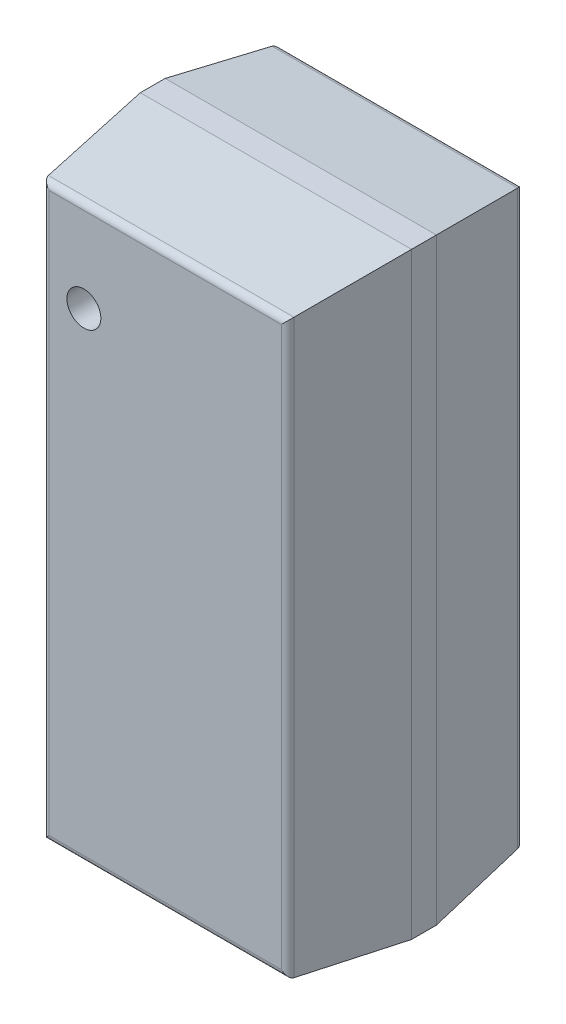
ISO-10303-21;
HEADER;
FILE_DESCRIPTION(('STEP AP214'),'2;1');
FILE_NAME('part.step','',(''),(''),'','','');
FILE_SCHEMA(('AUTOMOTIVE_DESIGN { 1 0 10303 214 1 1 1 1 }'));
ENDSEC;
DATA;
#1=APPLICATION_CONTEXT('core data for automotive mechanical design processes');
#2=APPLICATION_PROTOCOL_DEFINITION('international standard','automotive_design',2000,#1);
#3=PRODUCT_CONTEXT('',#1,'mechanical');
#4=PRODUCT('Part','Part','',(#3));
#5=PRODUCT_RELATED_PRODUCT_CATEGORY('part','',(#4));
#6=PRODUCT_DEFINITION_FORMATION('','',#4);
#7=PRODUCT_DEFINITION_CONTEXT('part definition',#1,'design');
#8=PRODUCT_DEFINITION('design','',#6,#7);
#9=PRODUCT_DEFINITION_SHAPE('','',#8);
#10=(LENGTH_UNIT() NAMED_UNIT(*) SI_UNIT(.MILLI.,.METRE.));
#11=(NAMED_UNIT(*) PLANE_ANGLE_UNIT() SI_UNIT($,.RADIAN.));
#12=(NAMED_UNIT(*) SI_UNIT($,.STERADIAN.) SOLID_ANGLE_UNIT());
#13=UNCERTAINTY_MEASURE_WITH_UNIT(LENGTH_MEASURE(1.E-05),#10,'distance_accuracy_value','');
#14=(GEOMETRIC_REPRESENTATION_CONTEXT(3) GLOBAL_UNCERTAINTY_ASSIGNED_CONTEXT((#13)) GLOBAL_UNIT_ASSIGNED_CONTEXT((#10,
#11,#12)) REPRESENTATION_CONTEXT('',''));
#15=CARTESIAN_POINT('',(0.,0.,0.));
#16=DIRECTION('',(0.,0.,1.));
#17=DIRECTION('',(1.,0.,0.));
#18=AXIS2_PLACEMENT_3D('',#15,#16,#17);
#19=CARTESIAN_POINT('',(-0.3975,0.95,1.08));
#20=DIRECTION('',(0.,0.,1.));
#21=DIRECTION('',(1.,0.,0.));
#22=AXIS2_PLACEMENT_3D('',#19,#20,#21);
#23=PLANE('',#22);
#24=CARTESIAN_POINT('',(-0.3975,0.95,1.08));
#25=DIRECTION('',(0.,0.,1.));
#26=DIRECTION('',(1.,0.,0.));
#27=AXIS2_PLACEMENT_3D('',#24,#25,#26);
#28=CIRCLE('',#27,0.0828125);
#29=CARTESIAN_POINT('',(-0.3146875,0.95,1.08));
#30=VERTEX_POINT('',#29);
#31=EDGE_CURVE('E20',#30,#30,#28,.T.);
#32=ORIENTED_EDGE('',*,*,#31,.T.);
#33=EDGE_LOOP('',(#32));
#34=FACE_BOUND('',#33,.T.);
#35=ADVANCED_FACE('F17',(#34),#23,.T.);
#36=CARTESIAN_POINT('',(-0.3975,0.95,1.08));
#37=DIRECTION('',(0.,0.,1.));
#38=DIRECTION('',(1.,0.,0.));
#39=AXIS2_PLACEMENT_3D('',#36,#37,#38);
#40=CYLINDRICAL_SURFACE('',#39,0.0828125);
#41=CARTESIAN_POINT('',(-0.3975,0.95,1.2));
#42=DIRECTION('',(0.,0.,1.));
#43=DIRECTION('',(1.,0.,0.));
#44=AXIS2_PLACEMENT_3D('',#41,#42,#43);
#45=CIRCLE('',#44,0.0828125);
#46=CARTESIAN_POINT('',(-0.3146875,0.95,1.2));
#47=VERTEX_POINT('',#46);
#48=EDGE_CURVE('E100',#47,#47,#45,.F.);
#49=ORIENTED_EDGE('',*,*,#48,.F.);
#50=EDGE_LOOP('',(#49));
#51=FACE_BOUND('',#50,.T.);
#52=ORIENTED_EDGE('',*,*,#31,.F.);
#53=EDGE_LOOP('',(#52));
#54=FACE_BOUND('',#53,.T.);
#55=ADVANCED_FACE('F496',(#51,#54),#40,.F.);
#56=CARTESIAN_POINT('',(-0.6625,-1.46,1.2));
#57=DIRECTION('',(0.,0.,1.));
#58=DIRECTION('',(1.,0.,0.));
#59=AXIS2_PLACEMENT_3D('',#56,#57,#58);
#60=PLANE('',#59);
#61=ORIENTED_EDGE('',*,*,#48,.T.);
#62=EDGE_LOOP('',(#61));
#63=FACE_BOUND('',#62,.T.);
#64=DIRECTION('',(0.,1.,0.));
#65=VECTOR('',#64,1.);
#66=CARTESIAN_POINT('',(0.56693691466,-1.39375,1.2));
#67=LINE('',#66,#65);
#68=CARTESIAN_POINT('',(0.56693691466,1.36443691466,1.2));
#69=VERTEX_POINT('',#68);
#70=CARTESIAN_POINT('',(0.56693691466,-1.36443691466,1.2));
#71=VERTEX_POINT('',#70);
#72=EDGE_CURVE('E107',#69,#71,#67,.F.);
#73=ORIENTED_EDGE('',*,*,#72,.F.);
#74=DIRECTION('',(1.,0.,0.));
#75=VECTOR('',#74,1.);
#76=CARTESIAN_POINT('',(-0.6625,1.36443691466,1.2));
#77=LINE('',#76,#75);
#78=CARTESIAN_POINT('',(-0.56693691466,1.36443691466,1.2));
#79=VERTEX_POINT('',#78);
#80=EDGE_CURVE('E96',#69,#79,#77,.F.);
#81=ORIENTED_EDGE('',*,*,#80,.T.);
#82=DIRECTION('',(0.,1.,0.));
#83=VECTOR('',#82,1.);
#84=CARTESIAN_POINT('',(-0.56693691466,-1.39375,1.2));
#85=LINE('',#84,#83);
#86=CARTESIAN_POINT('',(-0.56693691466,-1.36443691466,1.2));
#87=VERTEX_POINT('',#86);
#88=EDGE_CURVE('E92',#87,#79,#85,.T.);
#89=ORIENTED_EDGE('',*,*,#88,.F.);
#90=DIRECTION('',(1.,0.,0.));
#91=VECTOR('',#90,1.);
#92=CARTESIAN_POINT('',(-0.59625,-1.36443691466,1.2));
#93=LINE('',#92,#91);
#94=EDGE_CURVE('E81',#71,#87,#93,.F.);
#95=ORIENTED_EDGE('',*,*,#94,.F.);
#96=EDGE_LOOP('',(#73,#81,#89,#95));
#97=FACE_BOUND('',#96,.T.);
#98=ADVANCED_FACE('F95',(#63,#97),#60,.T.);
#99=CARTESIAN_POINT('',(-0.56693691466,-1.39375,1.166875));
#100=DIRECTION('',(0.,1.,0.));
#101=DIRECTION('',(0.,0.,1.));
#102=AXIS2_PLACEMENT_3D('',#99,#100,#101);
#103=CYLINDRICAL_SURFACE('',#102,0.033125);
#104=CARTESIAN_POINT('',(-0.56693691466,1.36443691466,1.166875));
#105=DIRECTION('',(0.707106781186547,0.707106781186547,0.));
#106=DIRECTION('',(0.707106781186547,-0.707106781186547,0.));
#107=AXIS2_PLACEMENT_3D('',#104,#105,#106);
#108=ELLIPSE('',#107,0.0468458242536088,0.033125);
#109=CARTESIAN_POINT('',(-0.59981590205622,1.39731590205646,1.17090461695283));
#110=VERTEX_POINT('',#109);
#111=EDGE_CURVE('E129',#110,#79,#108,.T.);
#112=ORIENTED_EDGE('',*,*,#111,.F.);
#113=DIRECTION('',(0.,1.,0.));
#114=VECTOR('',#113,1.);
#115=CARTESIAN_POINT('',(-0.59981590205648,-1.46,1.17090461695306));
#116=LINE('',#115,#114);
#117=CARTESIAN_POINT('',(-0.59981590205622,-1.39731590205646,1.17090461695283));
#118=VERTEX_POINT('',#117);
#119=EDGE_CURVE('E104',#110,#118,#116,.F.);
#120=ORIENTED_EDGE('',*,*,#119,.T.);
#121=CARTESIAN_POINT('',(-0.56693691466,-1.36443691466,1.166875));
#122=DIRECTION('',(0.707106781186547,-0.707106781186547,0.));
#123=DIRECTION('',(0.707106781186547,0.707106781186547,0.));
#124=AXIS2_PLACEMENT_3D('',#121,#122,#123);
#125=ELLIPSE('',#124,0.0468458242536088,0.033125);
#126=EDGE_CURVE('E86',#87,#118,#125,.T.);
#127=ORIENTED_EDGE('',*,*,#126,.F.);
#128=ORIENTED_EDGE('',*,*,#88,.T.);
#129=EDGE_LOOP('',(#112,#120,#127,#128));
#130=FACE_BOUND('',#129,.T.);
#131=ADVANCED_FACE('F103',(#130),#103,.T.);
#132=CARTESIAN_POINT('',(-0.59625,-1.36443691466,1.166875));
#133=DIRECTION('',(1.,0.,0.));
#134=DIRECTION('',(0.,0.,-1.));
#135=AXIS2_PLACEMENT_3D('',#132,#133,#134);
#136=CYLINDRICAL_SURFACE('',#135,0.033125);
#137=ORIENTED_EDGE('',*,*,#94,.T.);
#138=ORIENTED_EDGE('',*,*,#126,.T.);
#139=DIRECTION('',(1.,0.,0.));
#140=VECTOR('',#139,1.);
#141=CARTESIAN_POINT('',(-0.6625,-1.39731590205648,1.17090461695306));
#142=LINE('',#141,#140);
#143=CARTESIAN_POINT('',(0.59981590205646,-1.39731590205622,1.17090461695283));
#144=VERTEX_POINT('',#143);
#145=EDGE_CURVE('E141',#118,#144,#142,.T.);
#146=ORIENTED_EDGE('',*,*,#145,.T.);
#147=CARTESIAN_POINT('',(0.56693691466,-1.36443691466,1.166875));
#148=DIRECTION('',(0.707106781186547,0.707106781186547,0.));
#149=DIRECTION('',(-0.707106781186547,0.707106781186547,0.));
#150=AXIS2_PLACEMENT_3D('',#147,#148,#149);
#151=ELLIPSE('',#150,0.0468458242536088,0.033125);
#152=EDGE_CURVE('E88',#71,#144,#151,.T.);
#153=ORIENTED_EDGE('',*,*,#152,.F.);
#154=EDGE_LOOP('',(#137,#138,#146,#153));
#155=FACE_BOUND('',#154,.T.);
#156=ADVANCED_FACE('F83',(#155),#136,.T.);
#157=CARTESIAN_POINT('',(0.56693691466,-1.39375,1.166875));
#158=DIRECTION('',(0.,1.,0.));
#159=DIRECTION('',(0.,0.,1.));
#160=AXIS2_PLACEMENT_3D('',#157,#158,#159);
#161=CYLINDRICAL_SURFACE('',#160,0.033125);
#162=CARTESIAN_POINT('',(0.56693691466,1.36443691466,1.166875));
#163=DIRECTION('',(0.707106781186547,-0.707106781186547,0.));
#164=DIRECTION('',(0.707106781186547,0.707106781186547,0.));
#165=AXIS2_PLACEMENT_3D('',#162,#163,#164);
#166=ELLIPSE('',#165,0.0468458242536088,0.033125);
#167=CARTESIAN_POINT('',(0.59981590205622,1.39731590205646,1.17090461695283));
#168=VERTEX_POINT('',#167);
#169=EDGE_CURVE('E130',#69,#168,#166,.F.);
#170=ORIENTED_EDGE('',*,*,#169,.F.);
#171=ORIENTED_EDGE('',*,*,#72,.T.);
#172=ORIENTED_EDGE('',*,*,#152,.T.);
#173=DIRECTION('',(0.,1.,0.));
#174=VECTOR('',#173,1.);
#175=CARTESIAN_POINT('',(0.59981590205648,-1.46,1.17090461695306));
#176=LINE('',#175,#174);
#177=EDGE_CURVE('E139',#168,#144,#176,.F.);
#178=ORIENTED_EDGE('',*,*,#177,.F.);
#179=EDGE_LOOP('',(#170,#171,#172,#178));
#180=FACE_BOUND('',#179,.T.);
#181=ADVANCED_FACE('F463',(#180),#161,.T.);
#182=CARTESIAN_POINT('',(-0.59625,1.36443691466,1.166875));
#183=DIRECTION('',(1.,0.,0.));
#184=DIRECTION('',(0.,0.,-1.));
#185=AXIS2_PLACEMENT_3D('',#182,#183,#184);
#186=CYLINDRICAL_SURFACE('',#185,0.033125);
#187=DIRECTION('',(1.,0.,0.));
#188=VECTOR('',#187,1.);
#189=CARTESIAN_POINT('',(-0.6625,1.39731590205648,1.17090461695306));
#190=LINE('',#189,#188);
#191=EDGE_CURVE('E149',#110,#168,#190,.T.);
#192=ORIENTED_EDGE('',*,*,#191,.F.);
#193=ORIENTED_EDGE('',*,*,#111,.T.);
#194=ORIENTED_EDGE('',*,*,#80,.F.);
#195=ORIENTED_EDGE('',*,*,#169,.T.);
#196=EDGE_LOOP('',(#192,#193,#194,#195));
#197=FACE_BOUND('',#196,.T.);
#198=ADVANCED_FACE('F453',(#197),#186,.T.);
#199=CARTESIAN_POINT('',(-0.629375,-1.46,0.929722087653));
#200=DIRECTION('',(0.992573204420907,0.,-0.121648813662989));
#201=DIRECTION('',(-0.121648813662989,0.,-0.992573204420907));
#202=AXIS2_PLACEMENT_3D('',#199,#200,#201);
#203=PLANE('',#202);
#204=DIRECTION('',(0.12075857619676,-0.120758576195836,0.985309460296655));
#205=VECTOR('',#204,1.);
#206=CARTESIAN_POINT('',(-0.6625,1.46,0.659444175305));
#207=LINE('',#206,#205);
#208=CARTESIAN_POINT('',(-0.6625,1.46,0.659444175305));
#209=VERTEX_POINT('',#208);
#210=EDGE_CURVE('E155',#209,#110,#207,.T.);
#211=ORIENTED_EDGE('',*,*,#210,.F.);
#212=DIRECTION('',(0.,1.,0.));
#213=VECTOR('',#212,1.);
#214=CARTESIAN_POINT('',(-0.6625,-1.46,0.659444175305));
#215=LINE('',#214,#213);
#216=CARTESIAN_POINT('',(-0.6625,-1.46,0.659444175305));
#217=VERTEX_POINT('',#216);
#218=EDGE_CURVE('E183',#209,#217,#215,.F.);
#219=ORIENTED_EDGE('',*,*,#218,.T.);
#220=DIRECTION('',(0.12075857619676,0.120758576195836,0.985309460296655));
#221=VECTOR('',#220,1.);
#222=CARTESIAN_POINT('',(-0.6625,-1.46,0.659444175305));
#223=LINE('',#222,#221);
#224=EDGE_CURVE('E142',#217,#118,#223,.T.);
#225=ORIENTED_EDGE('',*,*,#224,.T.);
#226=ORIENTED_EDGE('',*,*,#119,.F.);
#227=EDGE_LOOP('',(#211,#219,#225,#226));
#228=FACE_BOUND('',#227,.T.);
#229=ADVANCED_FACE('F444',(#228),#203,.F.);
#230=CARTESIAN_POINT('',(-0.6625,-1.426875,0.929722087653));
#231=DIRECTION('',(0.,0.992573204420907,-0.121648813662989));
#232=DIRECTION('',(0.,0.121648813662989,0.992573204420907));
#233=AXIS2_PLACEMENT_3D('',#230,#231,#232);
#234=PLANE('',#233);
#235=DIRECTION('',(1.,0.,0.));
#236=VECTOR('',#235,1.);
#237=CARTESIAN_POINT('',(-0.6625,-1.46,0.659444175305));
#238=LINE('',#237,#236);
#239=CARTESIAN_POINT('',(0.6625,-1.46,0.659444175305));
#240=VERTEX_POINT('',#239);
#241=EDGE_CURVE('E170',#217,#240,#238,.T.);
#242=ORIENTED_EDGE('',*,*,#241,.T.);
#243=DIRECTION('',(0.120758576195836,-0.120758576196759,-0.985309460296655));
#244=VECTOR('',#243,1.);
#245=CARTESIAN_POINT('',(0.59981590205648,-1.397315902056,1.17090461695306));
#246=LINE('',#245,#244);
#247=EDGE_CURVE('E144',#144,#240,#246,.T.);
#248=ORIENTED_EDGE('',*,*,#247,.F.);
#249=ORIENTED_EDGE('',*,*,#145,.F.);
#250=ORIENTED_EDGE('',*,*,#224,.F.);
#251=EDGE_LOOP('',(#242,#248,#249,#250));
#252=FACE_BOUND('',#251,.T.);
#253=ADVANCED_FACE('F435',(#252),#234,.F.);
#254=CARTESIAN_POINT('',(0.629375,-1.46,0.929722087653));
#255=DIRECTION('',(0.992573204420907,0.,0.121648813662989));
#256=DIRECTION('',(0.121648813662989,0.,-0.992573204420907));
#257=AXIS2_PLACEMENT_3D('',#254,#255,#256);
#258=PLANE('',#257);
#259=DIRECTION('',(0.12075857619676,0.120758576195836,-0.985309460296655));
#260=VECTOR('',#259,1.);
#261=CARTESIAN_POINT('',(0.599815902056,1.39731590205648,1.17090461695306));
#262=LINE('',#261,#260);
#263=CARTESIAN_POINT('',(0.6625,1.46,0.659444175305));
#264=VERTEX_POINT('',#263);
#265=EDGE_CURVE('E150',#168,#264,#262,.T.);
#266=ORIENTED_EDGE('',*,*,#265,.F.);
#267=ORIENTED_EDGE('',*,*,#177,.T.);
#268=ORIENTED_EDGE('',*,*,#247,.T.);
#269=DIRECTION('',(0.,1.,0.));
#270=VECTOR('',#269,1.);
#271=CARTESIAN_POINT('',(0.6625,-1.46,0.659444175305));
#272=LINE('',#271,#270);
#273=EDGE_CURVE('E180',#264,#240,#272,.F.);
#274=ORIENTED_EDGE('',*,*,#273,.F.);
#275=EDGE_LOOP('',(#266,#267,#268,#274));
#276=FACE_BOUND('',#275,.T.);
#277=ADVANCED_FACE('F426',(#276),#258,.T.);
#278=CARTESIAN_POINT('',(-0.6625,1.426875,0.929722087653));
#279=DIRECTION('',(0.,0.992573204420907,0.121648813662989));
#280=DIRECTION('',(0.,-0.121648813662989,0.992573204420907));
#281=AXIS2_PLACEMENT_3D('',#278,#279,#280);
#282=PLANE('',#281);
#283=DIRECTION('',(1.,0.,0.));
#284=VECTOR('',#283,1.);
#285=CARTESIAN_POINT('',(-0.6625,1.46,0.659444175305));
#286=LINE('',#285,#284);
#287=EDGE_CURVE('E202',#209,#264,#286,.T.);
#288=ORIENTED_EDGE('',*,*,#287,.F.);
#289=ORIENTED_EDGE('',*,*,#210,.T.);
#290=ORIENTED_EDGE('',*,*,#191,.T.);
#291=ORIENTED_EDGE('',*,*,#265,.T.);
#292=EDGE_LOOP('',(#288,#289,#290,#291));
#293=FACE_BOUND('',#292,.T.);
#294=ADVANCED_FACE('F417',(#293),#282,.T.);
#295=CARTESIAN_POINT('',(-0.6625,-1.46,0.05));
#296=DIRECTION('',(1.,0.,0.));
#297=DIRECTION('',(0.,0.,-1.));
#298=AXIS2_PLACEMENT_3D('',#295,#296,#297);
#299=PLANE('',#298);
#300=DIRECTION('',(0.,0.,1.));
#301=VECTOR('',#300,1.);
#302=CARTESIAN_POINT('',(-0.6625,1.46,0.05));
#303=LINE('',#302,#301);
#304=CARTESIAN_POINT('',(-0.662499999999971,1.45999999999991,0.538194175305012));
#305=VERTEX_POINT('',#304);
#306=EDGE_CURVE('E206',#305,#209,#303,.T.);
#307=ORIENTED_EDGE('',*,*,#306,.F.);
#308=DIRECTION('',(0.,1.,0.));
#309=VECTOR('',#308,1.);
#310=CARTESIAN_POINT('',(-0.662499999999883,-1.46,0.538194175305016));
#311=LINE('',#310,#309);
#312=CARTESIAN_POINT('',(-0.662499999999971,-1.45999999999994,0.538194175305012));
#313=VERTEX_POINT('',#312);
#314=EDGE_CURVE('E205',#313,#305,#311,.T.);
#315=ORIENTED_EDGE('',*,*,#314,.F.);
#316=DIRECTION('',(0.,0.,1.));
#317=VECTOR('',#316,1.);
#318=CARTESIAN_POINT('',(-0.6625,-1.46,0.05));
#319=LINE('',#318,#317);
#320=EDGE_CURVE('E173',#313,#217,#319,.T.);
#321=ORIENTED_EDGE('',*,*,#320,.T.);
#322=ORIENTED_EDGE('',*,*,#218,.F.);
#323=EDGE_LOOP('',(#307,#315,#321,#322));
#324=FACE_BOUND('',#323,.T.);
#325=ADVANCED_FACE('F407',(#324),#299,.F.);
#326=CARTESIAN_POINT('',(-0.6625,-1.46,0.05));
#327=DIRECTION('',(0.,1.,0.));
#328=DIRECTION('',(0.,0.,1.));
#329=AXIS2_PLACEMENT_3D('',#326,#327,#328);
#330=PLANE('',#329);
#331=ORIENTED_EDGE('',*,*,#320,.F.);
#332=DIRECTION('',(1.,0.,0.));
#333=VECTOR('',#332,1.);
#334=CARTESIAN_POINT('',(-0.6625,-1.45999999999988,0.538194175305016));
#335=LINE('',#334,#333);
#336=CARTESIAN_POINT('',(0.662499999999941,-1.45999999999997,0.538194175305016));
#337=VERTEX_POINT('',#336);
#338=EDGE_CURVE('E235',#337,#313,#335,.F.);
#339=ORIENTED_EDGE('',*,*,#338,.F.);
#340=DIRECTION('',(0.,0.,-1.));
#341=VECTOR('',#340,1.);
#342=CARTESIAN_POINT('',(0.6625,-1.46,0.05));
#343=LINE('',#342,#341);
#344=EDGE_CURVE('E172',#240,#337,#343,.T.);
#345=ORIENTED_EDGE('',*,*,#344,.F.);
#346=ORIENTED_EDGE('',*,*,#241,.F.);
#347=EDGE_LOOP('',(#331,#339,#345,#346));
#348=FACE_BOUND('',#347,.T.);
#349=ADVANCED_FACE('F398',(#348),#330,.F.);
#350=CARTESIAN_POINT('',(0.6625,-1.46,0.05));
#351=DIRECTION('',(1.,0.,0.));
#352=DIRECTION('',(0.,0.,-1.));
#353=AXIS2_PLACEMENT_3D('',#350,#351,#352);
#354=PLANE('',#353);
#355=DIRECTION('',(0.,0.,1.));
#356=VECTOR('',#355,1.);
#357=CARTESIAN_POINT('',(0.6625,1.46,0.05));
#358=LINE('',#357,#356);
#359=CARTESIAN_POINT('',(0.662499999999971,1.45999999999994,0.538194175305016));
#360=VERTEX_POINT('',#359);
#361=EDGE_CURVE('E210',#264,#360,#358,.F.);
#362=ORIENTED_EDGE('',*,*,#361,.F.);
#363=ORIENTED_EDGE('',*,*,#273,.T.);
#364=ORIENTED_EDGE('',*,*,#344,.T.);
#365=DIRECTION('',(0.,1.,0.));
#366=VECTOR('',#365,1.);
#367=CARTESIAN_POINT('',(0.662499999999883,-1.46,0.538194175305016));
#368=LINE('',#367,#366);
#369=EDGE_CURVE('E228',#337,#360,#368,.T.);
#370=ORIENTED_EDGE('',*,*,#369,.T.);
#371=EDGE_LOOP('',(#362,#363,#364,#370));
#372=FACE_BOUND('',#371,.T.);
#373=ADVANCED_FACE('F389',(#372),#354,.T.);
#374=CARTESIAN_POINT('',(-0.6625,1.46,0.05));
#375=DIRECTION('',(0.,1.,0.));
#376=DIRECTION('',(0.,0.,1.));
#377=AXIS2_PLACEMENT_3D('',#374,#375,#376);
#378=PLANE('',#377);
#379=ORIENTED_EDGE('',*,*,#306,.T.);
#380=ORIENTED_EDGE('',*,*,#287,.T.);
#381=ORIENTED_EDGE('',*,*,#361,.T.);
#382=DIRECTION('',(1.,0.,0.));
#383=VECTOR('',#382,1.);
#384=CARTESIAN_POINT('',(-0.6625,1.45999999999988,0.538194175305016));
#385=LINE('',#384,#383);
#386=EDGE_CURVE('E254',#360,#305,#385,.F.);
#387=ORIENTED_EDGE('',*,*,#386,.T.);
#388=EDGE_LOOP('',(#379,#380,#381,#387));
#389=FACE_BOUND('',#388,.T.);
#390=ADVANCED_FACE('F380',(#389),#378,.T.);
#391=CARTESIAN_POINT('',(-0.629375,-1.46,0.294097087653));
#392=DIRECTION('',(-0.990917440087696,0.,-0.134471658463959));
#393=DIRECTION('',(-0.134471658463959,0.,0.990917440087696));
#394=AXIS2_PLACEMENT_3D('',#391,#392,#393);
#395=PLANE('',#394);
#396=DIRECTION('',(0.133272102100314,-0.133272102099908,-0.982077946806482));
#397=VECTOR('',#396,1.);
#398=CARTESIAN_POINT('',(-0.6625,1.45999999999988,0.538194175305016));
#399=LINE('',#398,#397);
#400=CARTESIAN_POINT('',(-0.600140724406929,1.39764072440699,0.0786706263133805));
#401=VERTEX_POINT('',#400);
#402=EDGE_CURVE('E256',#305,#401,#399,.T.);
#403=ORIENTED_EDGE('',*,*,#402,.T.);
#404=DIRECTION('',(0.,1.,0.));
#405=VECTOR('',#404,1.);
#406=CARTESIAN_POINT('',(-0.600140724406906,-1.39375,0.0786706263133927));
#407=LINE('',#406,#405);
#408=CARTESIAN_POINT('',(-0.600140724406929,-1.39764072440699,0.0786706263133805));
#409=VERTEX_POINT('',#408);
#410=EDGE_CURVE('E128',#409,#401,#407,.T.);
#411=ORIENTED_EDGE('',*,*,#410,.F.);
#412=DIRECTION('',(0.133272102100314,0.133272102099908,-0.982077946806482));
#413=VECTOR('',#412,1.);
#414=CARTESIAN_POINT('',(-0.6625,-1.45999999999988,0.538194175305016));
#415=LINE('',#414,#413);
#416=EDGE_CURVE('E237',#313,#409,#415,.T.);
#417=ORIENTED_EDGE('',*,*,#416,.F.);
#418=ORIENTED_EDGE('',*,*,#314,.T.);
#419=EDGE_LOOP('',(#403,#411,#417,#418));
#420=FACE_BOUND('',#419,.T.);
#421=ADVANCED_FACE('F301',(#420),#395,.T.);
#422=CARTESIAN_POINT('',(-0.6625,-1.426875,0.294097087653));
#423=DIRECTION('',(0.,-0.990917440087696,-0.134471658463959));
#424=DIRECTION('',(0.,0.134471658463959,-0.990917440087696));
#425=AXIS2_PLACEMENT_3D('',#422,#423,#424);
#426=PLANE('',#425);
#427=ORIENTED_EDGE('',*,*,#338,.T.);
#428=ORIENTED_EDGE('',*,*,#416,.T.);
#429=DIRECTION('',(1.,0.,0.));
#430=VECTOR('',#429,1.);
#431=CARTESIAN_POINT('',(-0.59625,-1.39764072440691,0.0786706263133927));
#432=LINE('',#431,#430);
#433=CARTESIAN_POINT('',(0.600140724406989,-1.39764072440693,0.0786706263133805));
#434=VERTEX_POINT('',#433);
#435=EDGE_CURVE('E127',#434,#409,#432,.F.);
#436=ORIENTED_EDGE('',*,*,#435,.F.);
#437=DIRECTION('',(0.133272102099908,-0.133272102100313,0.982077946806482));
#438=VECTOR('',#437,1.);
#439=CARTESIAN_POINT('',(0.600140724407073,-1.397640724407,0.0786706263133701));
#440=LINE('',#439,#438);
#441=EDGE_CURVE('E231',#434,#337,#440,.T.);
#442=ORIENTED_EDGE('',*,*,#441,.T.);
#443=EDGE_LOOP('',(#427,#428,#436,#442));
#444=FACE_BOUND('',#443,.T.);
#445=ADVANCED_FACE('F275',(#444),#426,.T.);
#446=CARTESIAN_POINT('',(0.629375,-1.46,0.294097087653));
#447=DIRECTION('',(-0.990917440087696,0.,0.134471658463959));
#448=DIRECTION('',(0.134471658463959,0.,0.990917440087696));
#449=AXIS2_PLACEMENT_3D('',#446,#447,#448);
#450=PLANE('',#449);
#451=DIRECTION('',(0.133272102100314,0.133272102099908,0.982077946806482));
#452=VECTOR('',#451,1.);
#453=CARTESIAN_POINT('',(0.600140724407,1.39764072440707,0.0786706263133702));
#454=LINE('',#453,#452);
#455=CARTESIAN_POINT('',(0.600140724406929,1.39764072440699,0.0786706263133805));
#456=VERTEX_POINT('',#455);
#457=EDGE_CURVE('E230',#456,#360,#454,.T.);
#458=ORIENTED_EDGE('',*,*,#457,.T.);
#459=ORIENTED_EDGE('',*,*,#369,.F.);
#460=ORIENTED_EDGE('',*,*,#441,.F.);
#461=DIRECTION('',(0.,1.,0.));
#462=VECTOR('',#461,1.);
#463=CARTESIAN_POINT('',(0.600140724406906,-1.39375,0.0786706263133927));
#464=LINE('',#463,#462);
#465=EDGE_CURVE('E124',#456,#434,#464,.F.);
#466=ORIENTED_EDGE('',*,*,#465,.F.);
#467=EDGE_LOOP('',(#458,#459,#460,#466));
#468=FACE_BOUND('',#467,.T.);
#469=ADVANCED_FACE('F280',(#468),#450,.F.);
#470=CARTESIAN_POINT('',(-0.6625,1.426875,0.294097087653));
#471=DIRECTION('',(0.,-0.990917440087696,0.134471658463959));
#472=DIRECTION('',(0.,-0.134471658463959,-0.990917440087696));
#473=AXIS2_PLACEMENT_3D('',#470,#471,#472);
#474=PLANE('',#473);
#475=ORIENTED_EDGE('',*,*,#386,.F.);
#476=ORIENTED_EDGE('',*,*,#457,.F.);
#477=DIRECTION('',(1.,0.,0.));
#478=VECTOR('',#477,1.);
#479=CARTESIAN_POINT('',(-0.59625,1.39764072440691,0.0786706263133927));
#480=LINE('',#479,#478);
#481=EDGE_CURVE('E118',#401,#456,#480,.T.);
#482=ORIENTED_EDGE('',*,*,#481,.F.);
#483=ORIENTED_EDGE('',*,*,#402,.F.);
#484=EDGE_LOOP('',(#475,#476,#482,#483));
#485=FACE_BOUND('',#484,.T.);
#486=ADVANCED_FACE('F303',(#485),#474,.F.);
#487=CARTESIAN_POINT('',(-0.567316584204,-1.39375,0.083125));
#488=DIRECTION('',(0.,1.,0.));
#489=DIRECTION('',(0.,0.,1.));
#490=AXIS2_PLACEMENT_3D('',#487,#488,#489);
#491=CYLINDRICAL_SURFACE('',#490,0.033125);
#492=DIRECTION('',(0.,1.,0.));
#493=VECTOR('',#492,1.);
#494=CARTESIAN_POINT('',(-0.567316584204,-1.46,0.05));
#495=LINE('',#494,#493);
#496=CARTESIAN_POINT('',(-0.567316584204,1.364816584204,0.05));
#497=VERTEX_POINT('',#496);
#498=CARTESIAN_POINT('',(-0.567316584204,-1.364816584204,0.05));
#499=VERTEX_POINT('',#498);
#500=EDGE_CURVE('E117',#497,#499,#495,.F.);
#501=ORIENTED_EDGE('',*,*,#500,.T.);
#502=CARTESIAN_POINT('',(-0.567316584204,-1.364816584204,0.083125));
#503=DIRECTION('',(0.707106781186547,-0.707106781186547,0.));
#504=DIRECTION('',(0.707106781186547,0.707106781186547,0.));
#505=AXIS2_PLACEMENT_3D('',#502,#503,#504);
#506=ELLIPSE('',#505,0.0468458242536088,0.033125);
#507=EDGE_CURVE('E125',#409,#499,#506,.T.);
#508=ORIENTED_EDGE('',*,*,#507,.F.);
#509=ORIENTED_EDGE('',*,*,#410,.T.);
#510=CARTESIAN_POINT('',(-0.567316584204,1.364816584204,0.083125));
#511=DIRECTION('',(0.707106781186547,0.707106781186547,0.));
#512=DIRECTION('',(0.707106781186547,-0.707106781186547,0.));
#513=AXIS2_PLACEMENT_3D('',#510,#511,#512);
#514=ELLIPSE('',#513,0.0468458242536088,0.033125);
#515=EDGE_CURVE('E119',#497,#401,#514,.T.);
#516=ORIENTED_EDGE('',*,*,#515,.F.);
#517=EDGE_LOOP('',(#501,#508,#509,#516));
#518=FACE_BOUND('',#517,.T.);
#519=ADVANCED_FACE('F297',(#518),#491,.T.);
#520=CARTESIAN_POINT('',(-0.59625,-1.364816584204,0.083125));
#521=DIRECTION('',(1.,0.,0.));
#522=DIRECTION('',(0.,0.,-1.));
#523=AXIS2_PLACEMENT_3D('',#520,#521,#522);
#524=CYLINDRICAL_SURFACE('',#523,0.033125);
#525=CARTESIAN_POINT('',(0.567316584204,-1.364816584204,0.083125));
#526=DIRECTION('',(0.707106781186547,0.707106781186547,0.));
#527=DIRECTION('',(-0.707106781186547,0.707106781186547,0.));
#528=AXIS2_PLACEMENT_3D('',#525,#526,#527);
#529=ELLIPSE('',#528,0.0468458242536088,0.033125);
#530=CARTESIAN_POINT('',(0.567316584204,-1.364816584204,0.05));
#531=VERTEX_POINT('',#530);
#532=EDGE_CURVE('E122',#434,#531,#529,.T.);
#533=ORIENTED_EDGE('',*,*,#532,.F.);
#534=ORIENTED_EDGE('',*,*,#435,.T.);
#535=ORIENTED_EDGE('',*,*,#507,.T.);
#536=DIRECTION('',(1.,0.,0.));
#537=VECTOR('',#536,1.);
#538=CARTESIAN_POINT('',(-0.6625,-1.364816584204,0.05));
#539=LINE('',#538,#537);
#540=EDGE_CURVE('E289',#499,#531,#539,.T.);
#541=ORIENTED_EDGE('',*,*,#540,.T.);
#542=EDGE_LOOP('',(#533,#534,#535,#541));
#543=FACE_BOUND('',#542,.T.);
#544=ADVANCED_FACE('F310',(#543),#524,.T.);
#545=CARTESIAN_POINT('',(0.567316584204,-1.39375,0.083125));
#546=DIRECTION('',(0.,1.,0.));
#547=DIRECTION('',(0.,0.,1.));
#548=AXIS2_PLACEMENT_3D('',#545,#546,#547);
#549=CYLINDRICAL_SURFACE('',#548,0.033125);
#550=ORIENTED_EDGE('',*,*,#465,.T.);
#551=ORIENTED_EDGE('',*,*,#532,.T.);
#552=DIRECTION('',(0.,1.,0.));
#553=VECTOR('',#552,1.);
#554=CARTESIAN_POINT('',(0.567316584204,-1.46,0.05));
#555=LINE('',#554,#553);
#556=CARTESIAN_POINT('',(0.567316584204,1.364816584204,0.05));
#557=VERTEX_POINT('',#556);
#558=EDGE_CURVE('E26',#531,#557,#555,.T.);
#559=ORIENTED_EDGE('',*,*,#558,.T.);
#560=CARTESIAN_POINT('',(0.567316584204,1.364816584204,0.083125));
#561=DIRECTION('',(0.707106781186547,-0.707106781186547,0.));
#562=DIRECTION('',(0.707106781186547,0.707106781186547,0.));
#563=AXIS2_PLACEMENT_3D('',#560,#561,#562);
#564=ELLIPSE('',#563,0.0468458242536088,0.033125);
#565=EDGE_CURVE('E34',#456,#557,#564,.F.);
#566=ORIENTED_EDGE('',*,*,#565,.F.);
#567=EDGE_LOOP('',(#550,#551,#559,#566));
#568=FACE_BOUND('',#567,.T.);
#569=ADVANCED_FACE('F282',(#568),#549,.T.);
#570=CARTESIAN_POINT('',(-0.59625,1.364816584204,0.083125));
#571=DIRECTION('',(1.,0.,0.));
#572=DIRECTION('',(0.,0.,-1.));
#573=AXIS2_PLACEMENT_3D('',#570,#571,#572);
#574=CYLINDRICAL_SURFACE('',#573,0.033125);
#575=ORIENTED_EDGE('',*,*,#565,.T.);
#576=DIRECTION('',(1.,0.,0.));
#577=VECTOR('',#576,1.);
#578=CARTESIAN_POINT('',(-0.6625,1.364816584204,0.05));
#579=LINE('',#578,#577);
#580=EDGE_CURVE('E11',#557,#497,#579,.F.);
#581=ORIENTED_EDGE('',*,*,#580,.T.);
#582=ORIENTED_EDGE('',*,*,#515,.T.);
#583=ORIENTED_EDGE('',*,*,#481,.T.);
#584=EDGE_LOOP('',(#575,#581,#582,#583));
#585=FACE_BOUND('',#584,.T.);
#586=ADVANCED_FACE('F298',(#585),#574,.T.);
#587=CARTESIAN_POINT('',(-0.6625,-1.46,0.05));
#588=DIRECTION('',(0.,0.,1.));
#589=DIRECTION('',(1.,0.,0.));
#590=AXIS2_PLACEMENT_3D('',#587,#588,#589);
#591=PLANE('',#590);
#592=ORIENTED_EDGE('',*,*,#558,.F.);
#593=ORIENTED_EDGE('',*,*,#540,.F.);
#594=ORIENTED_EDGE('',*,*,#500,.F.);
#595=ORIENTED_EDGE('',*,*,#580,.F.);
#596=EDGE_LOOP('',(#592,#593,#594,#595));
#597=FACE_BOUND('',#596,.T.);
#598=ADVANCED_FACE('F308',(#597),#591,.F.);
#599=CLOSED_SHELL('',(#35,#55,#98,#131,#156,#181,#198,#229,#253,#277,#294,#325,#349,#373,#390,
#421,#445,#469,#486,#519,#544,#569,#586,#598));
#600=MANIFOLD_SOLID_BREP('B1',#599);
#601=ADVANCED_BREP_SHAPE_REPRESENTATION('',(#18,#600),#14);
#602=SHAPE_DEFINITION_REPRESENTATION(#9,#601);
ENDSEC;
END-ISO-10303-21;
